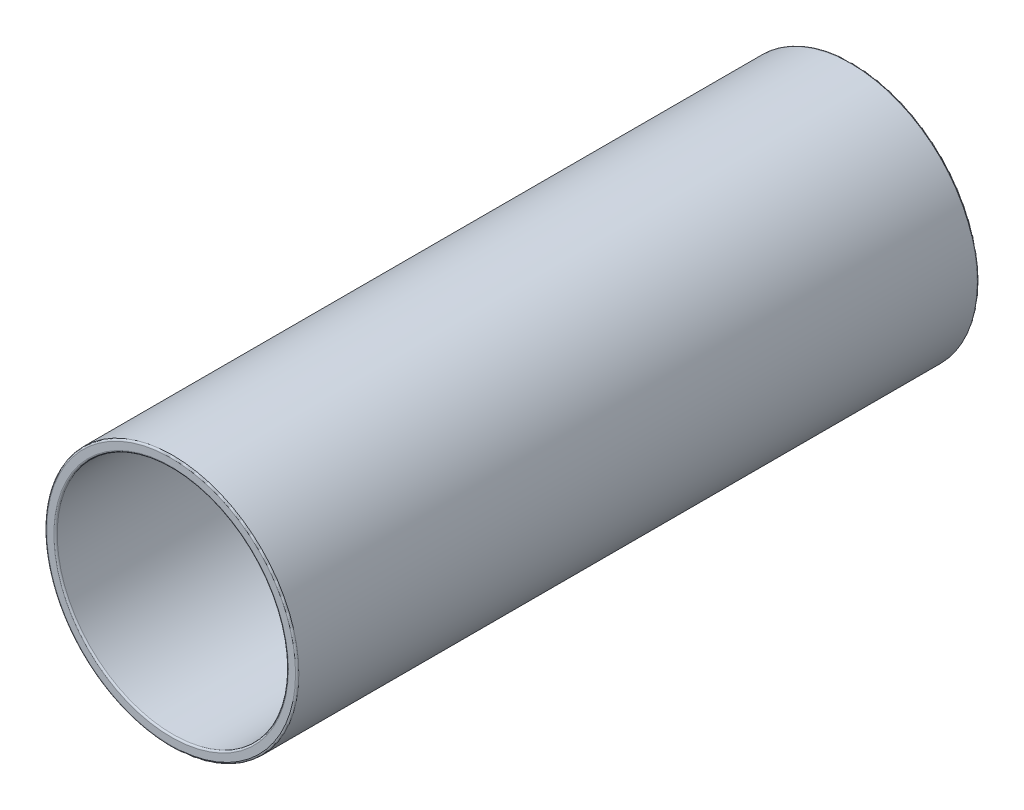
ISO-10303-21;
HEADER;
FILE_DESCRIPTION(('STEP AP214'),'2;1');
FILE_NAME('part.step','',(''),(''),'','','');
FILE_SCHEMA(('AUTOMOTIVE_DESIGN { 1 0 10303 214 1 1 1 1 }'));
ENDSEC;
DATA;
#1=APPLICATION_CONTEXT('core data for automotive mechanical design processes');
#2=APPLICATION_PROTOCOL_DEFINITION('international standard','automotive_design',2000,#1);
#3=PRODUCT_CONTEXT('',#1,'mechanical');
#4=PRODUCT('Part','Part','',(#3));
#5=PRODUCT_RELATED_PRODUCT_CATEGORY('part','',(#4));
#6=PRODUCT_DEFINITION_FORMATION('','',#4);
#7=PRODUCT_DEFINITION_CONTEXT('part definition',#1,'design');
#8=PRODUCT_DEFINITION('design','',#6,#7);
#9=PRODUCT_DEFINITION_SHAPE('','',#8);
#10=(LENGTH_UNIT() NAMED_UNIT(*) SI_UNIT(.MILLI.,.METRE.));
#11=(NAMED_UNIT(*) PLANE_ANGLE_UNIT() SI_UNIT($,.RADIAN.));
#12=(NAMED_UNIT(*) SI_UNIT($,.STERADIAN.) SOLID_ANGLE_UNIT());
#13=UNCERTAINTY_MEASURE_WITH_UNIT(LENGTH_MEASURE(1.E-05),#10,'distance_accuracy_value','');
#14=(GEOMETRIC_REPRESENTATION_CONTEXT(3) GLOBAL_UNCERTAINTY_ASSIGNED_CONTEXT((#13)) GLOBAL_UNIT_ASSIGNED_CONTEXT((#10,
#11,#12)) REPRESENTATION_CONTEXT('',''));
#15=CARTESIAN_POINT('',(0.,0.,0.));
#16=DIRECTION('',(0.,0.,1.));
#17=DIRECTION('',(1.,0.,0.));
#18=AXIS2_PLACEMENT_3D('',#15,#16,#17);
#19=CARTESIAN_POINT('',(0.,0.,206.));
#20=DIRECTION('',(0.,0.,1.));
#21=DIRECTION('',(1.,0.,0.));
#22=AXIS2_PLACEMENT_3D('',#19,#20,#21);
#23=PLANE('',#22);
#24=CARTESIAN_POINT('',(0.,0.,206.));
#25=DIRECTION('',(0.,0.,1.));
#26=DIRECTION('',(1.,0.,0.));
#27=AXIS2_PLACEMENT_3D('',#24,#25,#26);
#28=CIRCLE('',#27,75.2);
#29=CARTESIAN_POINT('',(75.2,0.,206.));
#30=VERTEX_POINT('',#29);
#31=EDGE_CURVE('E46',#30,#30,#28,.T.);
#32=ORIENTED_EDGE('',*,*,#31,.T.);
#33=EDGE_LOOP('',(#32));
#34=FACE_BOUND('',#33,.T.);
#35=CARTESIAN_POINT('',(0.,0.,206.));
#36=DIRECTION('',(0.,0.,1.));
#37=DIRECTION('',(1.,0.,0.));
#38=AXIS2_PLACEMENT_3D('',#35,#36,#37);
#39=CIRCLE('',#38,70.85);
#40=CARTESIAN_POINT('',(70.85,0.,206.));
#41=VERTEX_POINT('',#40);
#42=EDGE_CURVE('E50',#41,#41,#39,.F.);
#43=ORIENTED_EDGE('',*,*,#42,.T.);
#44=EDGE_LOOP('',(#43));
#45=FACE_BOUND('',#44,.T.);
#46=ADVANCED_FACE('F35',(#34,#45),#23,.T.);
#47=CARTESIAN_POINT('',(0.,0.,-206.));
#48=DIRECTION('',(0.,0.,1.));
#49=DIRECTION('',(1.,0.,0.));
#50=AXIS2_PLACEMENT_3D('',#47,#48,#49);
#51=PLANE('',#50);
#52=CARTESIAN_POINT('',(0.,0.,-206.));
#53=DIRECTION('',(0.,0.,1.));
#54=DIRECTION('',(1.,0.,0.));
#55=AXIS2_PLACEMENT_3D('',#52,#53,#54);
#56=CIRCLE('',#55,75.2);
#57=CARTESIAN_POINT('',(75.2,0.,-206.));
#58=VERTEX_POINT('',#57);
#59=EDGE_CURVE('E55',#58,#58,#56,.F.);
#60=ORIENTED_EDGE('',*,*,#59,.T.);
#61=EDGE_LOOP('',(#60));
#62=FACE_BOUND('',#61,.T.);
#63=CARTESIAN_POINT('',(0.,0.,-206.));
#64=DIRECTION('',(0.,0.,1.));
#65=DIRECTION('',(1.,0.,0.));
#66=AXIS2_PLACEMENT_3D('',#63,#64,#65);
#67=CIRCLE('',#66,70.85);
#68=CARTESIAN_POINT('',(70.85,0.,-206.));
#69=VERTEX_POINT('',#68);
#70=EDGE_CURVE('E58',#69,#69,#67,.T.);
#71=ORIENTED_EDGE('',*,*,#70,.T.);
#72=EDGE_LOOP('',(#71));
#73=FACE_BOUND('',#72,.T.);
#74=ADVANCED_FACE('F80',(#62,#73),#51,.F.);
#75=CARTESIAN_POINT('',(0.,0.,206.));
#76=DIRECTION('',(0.,0.,-1.));
#77=DIRECTION('',(-1.,0.,0.));
#78=AXIS2_PLACEMENT_3D('',#75,#76,#77);
#79=CYLINDRICAL_SURFACE('',#78,76.2);
#80=CARTESIAN_POINT('',(0.,0.,-205.));
#81=DIRECTION('',(0.,0.,1.));
#82=DIRECTION('',(1.,0.,0.));
#83=AXIS2_PLACEMENT_3D('',#80,#81,#82);
#84=CIRCLE('',#83,76.2);
#85=CARTESIAN_POINT('',(76.2,0.,-205.));
#86=VERTEX_POINT('',#85);
#87=EDGE_CURVE('E61',#86,#86,#84,.T.);
#88=ORIENTED_EDGE('',*,*,#87,.T.);
#89=EDGE_LOOP('',(#88));
#90=FACE_BOUND('',#89,.T.);
#91=CARTESIAN_POINT('',(0.,0.,205.));
#92=DIRECTION('',(0.,0.,1.));
#93=DIRECTION('',(1.,0.,0.));
#94=AXIS2_PLACEMENT_3D('',#91,#92,#93);
#95=CIRCLE('',#94,76.2);
#96=CARTESIAN_POINT('',(76.2,0.,205.));
#97=VERTEX_POINT('',#96);
#98=EDGE_CURVE('E64',#97,#97,#95,.F.);
#99=ORIENTED_EDGE('',*,*,#98,.T.);
#100=EDGE_LOOP('',(#99));
#101=FACE_BOUND('',#100,.T.);
#102=ADVANCED_FACE('F68',(#90,#101),#79,.T.);
#103=CARTESIAN_POINT('',(0.,0.,206.));
#104=DIRECTION('',(0.,0.,-1.));
#105=DIRECTION('',(-1.,0.,0.));
#106=AXIS2_PLACEMENT_3D('',#103,#104,#105);
#107=CYLINDRICAL_SURFACE('',#106,69.85);
#108=CARTESIAN_POINT('',(0.,0.,-205.));
#109=DIRECTION('',(0.,0.,1.));
#110=DIRECTION('',(1.,0.,0.));
#111=AXIS2_PLACEMENT_3D('',#108,#109,#110);
#112=CIRCLE('',#111,69.85);
#113=CARTESIAN_POINT('',(69.85,0.,-205.));
#114=VERTEX_POINT('',#113);
#115=EDGE_CURVE('E10',#114,#114,#112,.F.);
#116=ORIENTED_EDGE('',*,*,#115,.T.);
#117=EDGE_LOOP('',(#116));
#118=FACE_BOUND('',#117,.T.);
#119=CARTESIAN_POINT('',(0.,0.,205.));
#120=DIRECTION('',(0.,0.,1.));
#121=DIRECTION('',(1.,0.,0.));
#122=AXIS2_PLACEMENT_3D('',#119,#120,#121);
#123=CIRCLE('',#122,69.85);
#124=CARTESIAN_POINT('',(69.85,0.,205.));
#125=VERTEX_POINT('',#124);
#126=EDGE_CURVE('E42',#125,#125,#123,.T.);
#127=ORIENTED_EDGE('',*,*,#126,.T.);
#128=EDGE_LOOP('',(#127));
#129=FACE_BOUND('',#128,.T.);
#130=ADVANCED_FACE('F96',(#118,#129),#107,.F.);
#131=CARTESIAN_POINT('',(0.,0.,-205.));
#132=DIRECTION('',(0.,0.,1.));
#133=DIRECTION('',(1.,0.,0.));
#134=AXIS2_PLACEMENT_3D('',#131,#132,#133);
#135=TOROIDAL_SURFACE('',#134,75.2,1.);
#136=ORIENTED_EDGE('',*,*,#59,.F.);
#137=EDGE_LOOP('',(#136));
#138=FACE_BOUND('',#137,.T.);
#139=ORIENTED_EDGE('',*,*,#87,.F.);
#140=EDGE_LOOP('',(#139));
#141=FACE_BOUND('',#140,.T.);
#142=ADVANCED_FACE('F74',(#138,#141),#135,.T.);
#143=CARTESIAN_POINT('',(0.,0.,205.));
#144=DIRECTION('',(0.,0.,1.));
#145=DIRECTION('',(1.,0.,0.));
#146=AXIS2_PLACEMENT_3D('',#143,#144,#145);
#147=TOROIDAL_SURFACE('',#146,75.2,1.);
#148=ORIENTED_EDGE('',*,*,#98,.F.);
#149=EDGE_LOOP('',(#148));
#150=FACE_BOUND('',#149,.T.);
#151=ORIENTED_EDGE('',*,*,#31,.F.);
#152=EDGE_LOOP('',(#151));
#153=FACE_BOUND('',#152,.T.);
#154=ADVANCED_FACE('F70',(#150,#153),#147,.T.);
#155=CARTESIAN_POINT('',(0.,0.,-205.));
#156=DIRECTION('',(0.,0.,1.));
#157=DIRECTION('',(1.,0.,0.));
#158=AXIS2_PLACEMENT_3D('',#155,#156,#157);
#159=TOROIDAL_SURFACE('',#158,70.85,1.);
#160=ORIENTED_EDGE('',*,*,#115,.F.);
#161=EDGE_LOOP('',(#160));
#162=FACE_BOUND('',#161,.T.);
#163=ORIENTED_EDGE('',*,*,#70,.F.);
#164=EDGE_LOOP('',(#163));
#165=FACE_BOUND('',#164,.T.);
#166=ADVANCED_FACE('F73',(#162,#165),#159,.T.);
#167=CARTESIAN_POINT('',(0.,0.,205.));
#168=DIRECTION('',(0.,0.,1.));
#169=DIRECTION('',(1.,0.,0.));
#170=AXIS2_PLACEMENT_3D('',#167,#168,#169);
#171=TOROIDAL_SURFACE('',#170,70.85,1.);
#172=ORIENTED_EDGE('',*,*,#42,.F.);
#173=EDGE_LOOP('',(#172));
#174=FACE_BOUND('',#173,.T.);
#175=ORIENTED_EDGE('',*,*,#126,.F.);
#176=EDGE_LOOP('',(#175));
#177=FACE_BOUND('',#176,.T.);
#178=ADVANCED_FACE('F37',(#174,#177),#171,.T.);
#179=CLOSED_SHELL('',(#46,#74,#102,#130,#142,#154,#166,#178));
#180=MANIFOLD_SOLID_BREP('B2',#179);
#181=ADVANCED_BREP_SHAPE_REPRESENTATION('',(#18,#180),#14);
#182=SHAPE_DEFINITION_REPRESENTATION(#9,#181);
ENDSEC;
END-ISO-10303-21;
